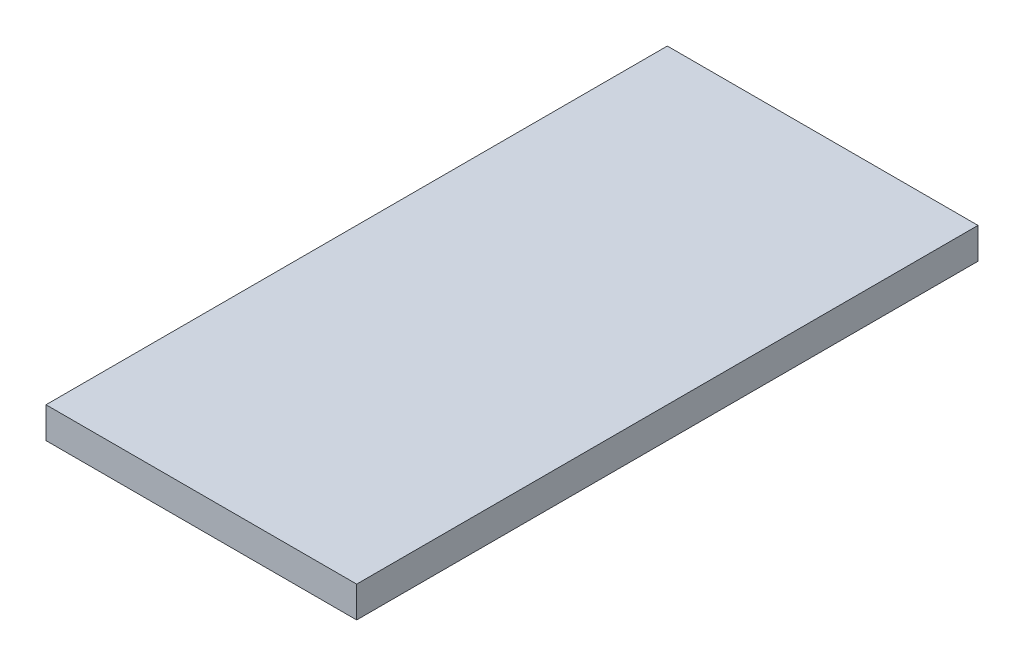
ISO-10303-21;
HEADER;
FILE_DESCRIPTION(('STEP AP214'),'2;1');
FILE_NAME('part.step','',(''),(''),'','','');
FILE_SCHEMA(('AUTOMOTIVE_DESIGN { 1 0 10303 214 1 1 1 1 }'));
ENDSEC;
DATA;
#1=APPLICATION_CONTEXT('core data for automotive mechanical design processes');
#2=APPLICATION_PROTOCOL_DEFINITION('international standard','automotive_design',2000,#1);
#3=PRODUCT_CONTEXT('',#1,'mechanical');
#4=PRODUCT('Part','Part','',(#3));
#5=PRODUCT_RELATED_PRODUCT_CATEGORY('part','',(#4));
#6=PRODUCT_DEFINITION_FORMATION('','',#4);
#7=PRODUCT_DEFINITION_CONTEXT('part definition',#1,'design');
#8=PRODUCT_DEFINITION('design','',#6,#7);
#9=PRODUCT_DEFINITION_SHAPE('','',#8);
#10=(LENGTH_UNIT() NAMED_UNIT(*) SI_UNIT(.MILLI.,.METRE.));
#11=(NAMED_UNIT(*) PLANE_ANGLE_UNIT() SI_UNIT($,.RADIAN.));
#12=(NAMED_UNIT(*) SI_UNIT($,.STERADIAN.) SOLID_ANGLE_UNIT());
#13=UNCERTAINTY_MEASURE_WITH_UNIT(LENGTH_MEASURE(1.E-05),#10,'distance_accuracy_value','');
#14=(GEOMETRIC_REPRESENTATION_CONTEXT(3) GLOBAL_UNCERTAINTY_ASSIGNED_CONTEXT((#13)) GLOBAL_UNIT_ASSIGNED_CONTEXT((#10,
#11,#12)) REPRESENTATION_CONTEXT('',''));
#15=CARTESIAN_POINT('',(0.,0.,0.));
#16=DIRECTION('',(0.,0.,1.));
#17=DIRECTION('',(1.,0.,0.));
#18=AXIS2_PLACEMENT_3D('',#15,#16,#17);
#19=CARTESIAN_POINT('',(0.,1.,0.));
#20=DIRECTION('',(1.,0.,0.));
#21=DIRECTION('',(0.,0.,-1.));
#22=AXIS2_PLACEMENT_3D('',#19,#20,#21);
#23=PLANE('',#22);
#24=DIRECTION('',(0.,0.,1.));
#25=VECTOR('',#24,1.);
#26=CARTESIAN_POINT('',(0.,0.,0.));
#27=LINE('',#26,#25);
#28=CARTESIAN_POINT('',(0.,0.,0.));
#29=VERTEX_POINT('',#28);
#30=CARTESIAN_POINT('',(0.,0.,20.));
#31=VERTEX_POINT('',#30);
#32=EDGE_CURVE('E102',#29,#31,#27,.T.);
#33=ORIENTED_EDGE('',*,*,#32,.T.);
#34=DIRECTION('',(0.,-1.,0.));
#35=VECTOR('',#34,1.);
#36=CARTESIAN_POINT('',(0.,1.,20.));
#37=LINE('',#36,#35);
#38=CARTESIAN_POINT('',(0.,1.,20.));
#39=VERTEX_POINT('',#38);
#40=EDGE_CURVE('E11',#39,#31,#37,.T.);
#41=ORIENTED_EDGE('',*,*,#40,.F.);
#42=DIRECTION('',(0.,0.,1.));
#43=VECTOR('',#42,1.);
#44=CARTESIAN_POINT('',(0.,1.,0.));
#45=LINE('',#44,#43);
#46=CARTESIAN_POINT('',(0.,1.,0.));
#47=VERTEX_POINT('',#46);
#48=EDGE_CURVE('E88',#47,#39,#45,.T.);
#49=ORIENTED_EDGE('',*,*,#48,.F.);
#50=DIRECTION('',(0.,-1.,0.));
#51=VECTOR('',#50,1.);
#52=CARTESIAN_POINT('',(0.,1.,0.));
#53=LINE('',#52,#51);
#54=EDGE_CURVE('E55',#47,#29,#53,.T.);
#55=ORIENTED_EDGE('',*,*,#54,.T.);
#56=EDGE_LOOP('',(#33,#41,#49,#55));
#57=FACE_BOUND('',#56,.T.);
#58=ADVANCED_FACE('F39',(#57),#23,.F.);
#59=CARTESIAN_POINT('',(0.,1.,20.));
#60=DIRECTION('',(0.,0.,-1.));
#61=DIRECTION('',(-1.,0.,0.));
#62=AXIS2_PLACEMENT_3D('',#59,#60,#61);
#63=PLANE('',#62);
#64=DIRECTION('',(1.,0.,0.));
#65=VECTOR('',#64,1.);
#66=CARTESIAN_POINT('',(0.,0.,20.));
#67=LINE('',#66,#65);
#68=CARTESIAN_POINT('',(10.,0.,20.));
#69=VERTEX_POINT('',#68);
#70=EDGE_CURVE('E93',#31,#69,#67,.T.);
#71=ORIENTED_EDGE('',*,*,#70,.T.);
#72=DIRECTION('',(0.,-1.,0.));
#73=VECTOR('',#72,1.);
#74=CARTESIAN_POINT('',(10.,1.,20.));
#75=LINE('',#74,#73);
#76=CARTESIAN_POINT('',(10.,1.,20.));
#77=VERTEX_POINT('',#76);
#78=EDGE_CURVE('E47',#77,#69,#75,.T.);
#79=ORIENTED_EDGE('',*,*,#78,.F.);
#80=DIRECTION('',(1.,0.,0.));
#81=VECTOR('',#80,1.);
#82=CARTESIAN_POINT('',(0.,1.,20.));
#83=LINE('',#82,#81);
#84=EDGE_CURVE('E80',#39,#77,#83,.T.);
#85=ORIENTED_EDGE('',*,*,#84,.F.);
#86=ORIENTED_EDGE('',*,*,#40,.T.);
#87=EDGE_LOOP('',(#71,#79,#85,#86));
#88=FACE_BOUND('',#87,.T.);
#89=ADVANCED_FACE('F92',(#88),#63,.F.);
#90=CARTESIAN_POINT('',(10.,1.,0.));
#91=DIRECTION('',(1.,0.,0.));
#92=DIRECTION('',(0.,0.,-1.));
#93=AXIS2_PLACEMENT_3D('',#90,#91,#92);
#94=PLANE('',#93);
#95=DIRECTION('',(0.,0.,1.));
#96=VECTOR('',#95,1.);
#97=CARTESIAN_POINT('',(10.,0.,0.));
#98=LINE('',#97,#96);
#99=CARTESIAN_POINT('',(10.,0.,0.));
#100=VERTEX_POINT('',#99);
#101=EDGE_CURVE('E105',#100,#69,#98,.T.);
#102=ORIENTED_EDGE('',*,*,#101,.F.);
#103=DIRECTION('',(0.,-1.,0.));
#104=VECTOR('',#103,1.);
#105=CARTESIAN_POINT('',(10.,1.,0.));
#106=LINE('',#105,#104);
#107=CARTESIAN_POINT('',(10.,1.,0.));
#108=VERTEX_POINT('',#107);
#109=EDGE_CURVE('E69',#108,#100,#106,.T.);
#110=ORIENTED_EDGE('',*,*,#109,.F.);
#111=DIRECTION('',(0.,0.,1.));
#112=VECTOR('',#111,1.);
#113=CARTESIAN_POINT('',(10.,1.,0.));
#114=LINE('',#113,#112);
#115=EDGE_CURVE('E87',#108,#77,#114,.T.);
#116=ORIENTED_EDGE('',*,*,#115,.T.);
#117=ORIENTED_EDGE('',*,*,#78,.T.);
#118=EDGE_LOOP('',(#102,#110,#116,#117));
#119=FACE_BOUND('',#118,.T.);
#120=ADVANCED_FACE('F96',(#119),#94,.T.);
#121=CARTESIAN_POINT('',(0.,1.,0.));
#122=DIRECTION('',(0.,0.,-1.));
#123=DIRECTION('',(-1.,0.,0.));
#124=AXIS2_PLACEMENT_3D('',#121,#122,#123);
#125=PLANE('',#124);
#126=DIRECTION('',(1.,0.,0.));
#127=VECTOR('',#126,1.);
#128=CARTESIAN_POINT('',(0.,0.,0.));
#129=LINE('',#128,#127);
#130=EDGE_CURVE('E107',#29,#100,#129,.T.);
#131=ORIENTED_EDGE('',*,*,#130,.F.);
#132=ORIENTED_EDGE('',*,*,#54,.F.);
#133=DIRECTION('',(1.,0.,0.));
#134=VECTOR('',#133,1.);
#135=CARTESIAN_POINT('',(0.,1.,0.));
#136=LINE('',#135,#134);
#137=EDGE_CURVE('E97',#47,#108,#136,.T.);
#138=ORIENTED_EDGE('',*,*,#137,.T.);
#139=ORIENTED_EDGE('',*,*,#109,.T.);
#140=EDGE_LOOP('',(#131,#132,#138,#139));
#141=FACE_BOUND('',#140,.T.);
#142=ADVANCED_FACE('F113',(#141),#125,.T.);
#143=CARTESIAN_POINT('',(0.,1.,0.));
#144=DIRECTION('',(0.,1.,0.));
#145=DIRECTION('',(0.,0.,1.));
#146=AXIS2_PLACEMENT_3D('',#143,#144,#145);
#147=PLANE('',#146);
#148=ORIENTED_EDGE('',*,*,#48,.T.);
#149=ORIENTED_EDGE('',*,*,#84,.T.);
#150=ORIENTED_EDGE('',*,*,#115,.F.);
#151=ORIENTED_EDGE('',*,*,#137,.F.);
#152=EDGE_LOOP('',(#148,#149,#150,#151));
#153=FACE_BOUND('',#152,.T.);
#154=ADVANCED_FACE('F84',(#153),#147,.T.);
#155=CARTESIAN_POINT('',(0.,0.,0.));
#156=DIRECTION('',(0.,1.,0.));
#157=DIRECTION('',(0.,0.,1.));
#158=AXIS2_PLACEMENT_3D('',#155,#156,#157);
#159=PLANE('',#158);
#160=ORIENTED_EDGE('',*,*,#32,.F.);
#161=ORIENTED_EDGE('',*,*,#130,.T.);
#162=ORIENTED_EDGE('',*,*,#101,.T.);
#163=ORIENTED_EDGE('',*,*,#70,.F.);
#164=EDGE_LOOP('',(#160,#161,#162,#163));
#165=FACE_BOUND('',#164,.T.);
#166=ADVANCED_FACE('F112',(#165),#159,.F.);
#167=CLOSED_SHELL('',(#58,#89,#120,#142,#154,#166));
#168=MANIFOLD_SOLID_BREP('B2',#167);
#169=ADVANCED_BREP_SHAPE_REPRESENTATION('',(#18,#168),#14);
#170=SHAPE_DEFINITION_REPRESENTATION(#9,#169);
ENDSEC;
END-ISO-10303-21;
